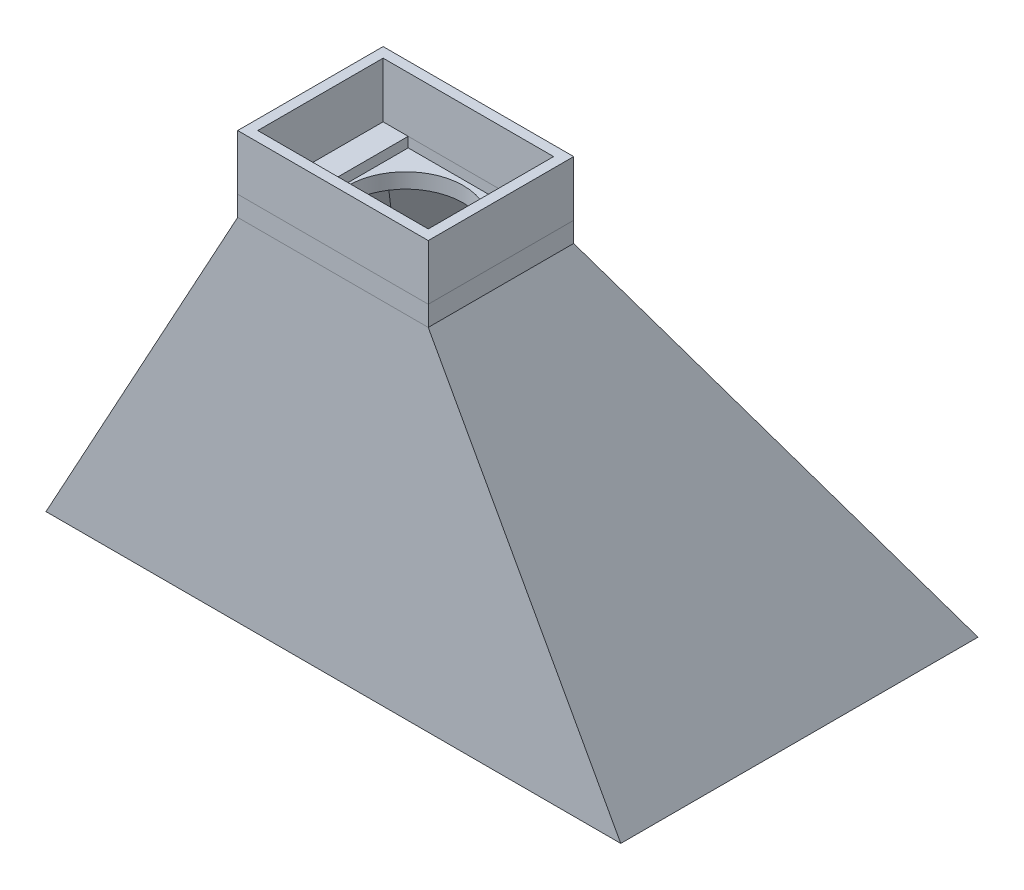
ISO-10303-21;
HEADER;
FILE_DESCRIPTION(('STEP AP214'),'2;1');
FILE_NAME('part.step','',(''),(''),'','','');
FILE_SCHEMA(('AUTOMOTIVE_DESIGN { 1 0 10303 214 1 1 1 1 }'));
ENDSEC;
DATA;
#1=APPLICATION_CONTEXT('core data for automotive mechanical design processes');
#2=APPLICATION_PROTOCOL_DEFINITION('international standard','automotive_design',2000,#1);
#3=PRODUCT_CONTEXT('',#1,'mechanical');
#4=PRODUCT('Part','Part','',(#3));
#5=PRODUCT_RELATED_PRODUCT_CATEGORY('part','',(#4));
#6=PRODUCT_DEFINITION_FORMATION('','',#4);
#7=PRODUCT_DEFINITION_CONTEXT('part definition',#1,'design');
#8=PRODUCT_DEFINITION('design','',#6,#7);
#9=PRODUCT_DEFINITION_SHAPE('','',#8);
#10=(LENGTH_UNIT() NAMED_UNIT(*) SI_UNIT(.MILLI.,.METRE.));
#11=(NAMED_UNIT(*) PLANE_ANGLE_UNIT() SI_UNIT($,.RADIAN.));
#12=(NAMED_UNIT(*) SI_UNIT($,.STERADIAN.) SOLID_ANGLE_UNIT());
#13=UNCERTAINTY_MEASURE_WITH_UNIT(LENGTH_MEASURE(1.E-05),#10,'distance_accuracy_value','');
#14=(GEOMETRIC_REPRESENTATION_CONTEXT(3) GLOBAL_UNCERTAINTY_ASSIGNED_CONTEXT((#13)) GLOBAL_UNIT_ASSIGNED_CONTEXT((#10,
#11,#12)) REPRESENTATION_CONTEXT('',''));
#15=CARTESIAN_POINT('',(0.,0.,0.));
#16=DIRECTION('',(0.,0.,1.));
#17=DIRECTION('',(1.,0.,0.));
#18=AXIS2_PLACEMENT_3D('',#15,#16,#17);
#19=CARTESIAN_POINT('',(0.,1789.,0.));
#20=DIRECTION('',(0.,-1.,0.));
#21=DIRECTION('',(0.,0.,-1.));
#22=AXIS2_PLACEMENT_3D('',#19,#20,#21);
#23=PLANE('',#22);
#24=DIRECTION('',(0.,0.,-1.));
#25=VECTOR('',#24,1.);
#26=CARTESIAN_POINT('',(926.,1789.,2.));
#27=LINE('',#26,#25);
#28=CARTESIAN_POINT('',(926.,1789.,2.));
#29=VERTEX_POINT('',#28);
#30=CARTESIAN_POINT('',(926.,1789.,-27.));
#31=VERTEX_POINT('',#30);
#32=EDGE_CURVE('E294',#29,#31,#27,.T.);
#33=ORIENTED_EDGE('',*,*,#32,.F.);
#34=DIRECTION('',(-1.,0.,0.));
#35=VECTOR('',#34,1.);
#36=CARTESIAN_POINT('',(926.,1789.,2.));
#37=LINE('',#36,#35);
#38=CARTESIAN_POINT('',(964.,1789.,2.));
#39=VERTEX_POINT('',#38);
#40=EDGE_CURVE('E300',#39,#29,#37,.T.);
#41=ORIENTED_EDGE('',*,*,#40,.F.);
#42=DIRECTION('',(0.,0.,1.));
#43=VECTOR('',#42,1.);
#44=CARTESIAN_POINT('',(964.,1789.,2.));
#45=LINE('',#44,#43);
#46=CARTESIAN_POINT('',(964.,1789.,-27.));
#47=VERTEX_POINT('',#46);
#48=EDGE_CURVE('E298',#47,#39,#45,.T.);
#49=ORIENTED_EDGE('',*,*,#48,.F.);
#50=DIRECTION('',(1.,0.,0.));
#51=VECTOR('',#50,1.);
#52=CARTESIAN_POINT('',(926.,1789.,-27.));
#53=LINE('',#52,#51);
#54=EDGE_CURVE('E112',#31,#47,#53,.T.);
#55=ORIENTED_EDGE('',*,*,#54,.F.);
#56=EDGE_LOOP('',(#33,#41,#49,#55));
#57=FACE_BOUND('',#56,.T.);
#58=DIRECTION('',(-1.,0.,0.));
#59=VECTOR('',#58,1.);
#60=CARTESIAN_POINT('',(933.,1789.,0.));
#61=LINE('',#60,#59);
#62=CARTESIAN_POINT('',(957.,1789.,0.));
#63=VERTEX_POINT('',#62);
#64=CARTESIAN_POINT('',(933.,1789.,0.));
#65=VERTEX_POINT('',#64);
#66=EDGE_CURVE('E272',#63,#65,#61,.T.);
#67=ORIENTED_EDGE('',*,*,#66,.T.);
#68=DIRECTION('',(0.,0.,-1.));
#69=VECTOR('',#68,1.);
#70=CARTESIAN_POINT('',(933.,1789.,0.));
#71=LINE('',#70,#69);
#72=CARTESIAN_POINT('',(933.,1789.,-25.));
#73=VERTEX_POINT('',#72);
#74=EDGE_CURVE('E275',#65,#73,#71,.T.);
#75=ORIENTED_EDGE('',*,*,#74,.T.);
#76=DIRECTION('',(1.,0.,0.));
#77=VECTOR('',#76,1.);
#78=CARTESIAN_POINT('',(933.,1789.,-25.));
#79=LINE('',#78,#77);
#80=CARTESIAN_POINT('',(957.,1789.,-25.));
#81=VERTEX_POINT('',#80);
#82=EDGE_CURVE('E278',#73,#81,#79,.T.);
#83=ORIENTED_EDGE('',*,*,#82,.T.);
#84=DIRECTION('',(0.,0.,1.));
#85=VECTOR('',#84,1.);
#86=CARTESIAN_POINT('',(957.,1789.,-25.));
#87=LINE('',#86,#85);
#88=EDGE_CURVE('E264',#81,#63,#87,.T.);
#89=ORIENTED_EDGE('',*,*,#88,.T.);
#90=EDGE_LOOP('',(#67,#75,#83,#89));
#91=FACE_BOUND('',#90,.T.);
#92=ADVANCED_FACE('F54',(#57,#91),#23,.F.);
#93=CARTESIAN_POINT('',(926.,1787.,2.));
#94=DIRECTION('',(1.,0.,0.));
#95=DIRECTION('',(0.,0.,-1.));
#96=AXIS2_PLACEMENT_3D('',#93,#94,#95);
#97=PLANE('',#96);
#98=ORIENTED_EDGE('',*,*,#32,.T.);
#99=DIRECTION('',(0.,1.,0.));
#100=VECTOR('',#99,1.);
#101=CARTESIAN_POINT('',(926.,1787.,-27.));
#102=LINE('',#101,#100);
#103=CARTESIAN_POINT('',(926.,1785.,-27.0000000000001));
#104=VERTEX_POINT('',#103);
#105=EDGE_CURVE('E13',#104,#31,#102,.T.);
#106=ORIENTED_EDGE('',*,*,#105,.F.);
#107=DIRECTION('',(0.,0.,1.));
#108=VECTOR('',#107,1.);
#109=CARTESIAN_POINT('',(926.,1785.,0.));
#110=LINE('',#109,#108);
#111=CARTESIAN_POINT('',(926.,1785.,2.));
#112=VERTEX_POINT('',#111);
#113=EDGE_CURVE('E138',#112,#104,#110,.F.);
#114=ORIENTED_EDGE('',*,*,#113,.F.);
#115=DIRECTION('',(0.,1.,0.));
#116=VECTOR('',#115,1.);
#117=CARTESIAN_POINT('',(926.,1787.,2.));
#118=LINE('',#117,#116);
#119=EDGE_CURVE('E303',#112,#29,#118,.T.);
#120=ORIENTED_EDGE('',*,*,#119,.T.);
#121=EDGE_LOOP('',(#98,#106,#114,#120));
#122=FACE_BOUND('',#121,.T.);
#123=ADVANCED_FACE('F56',(#122),#97,.F.);
#124=CARTESIAN_POINT('',(926.,1787.,-27.));
#125=DIRECTION('',(0.,0.,1.));
#126=DIRECTION('',(1.,0.,0.));
#127=AXIS2_PLACEMENT_3D('',#124,#125,#126);
#128=PLANE('',#127);
#129=ORIENTED_EDGE('',*,*,#54,.T.);
#130=DIRECTION('',(0.,1.,0.));
#131=VECTOR('',#130,1.);
#132=CARTESIAN_POINT('',(964.,1787.,-27.));
#133=LINE('',#132,#131);
#134=CARTESIAN_POINT('',(964.,1785.,-27.));
#135=VERTEX_POINT('',#134);
#136=EDGE_CURVE('E63',#135,#47,#133,.T.);
#137=ORIENTED_EDGE('',*,*,#136,.F.);
#138=DIRECTION('',(1.,0.,0.));
#139=VECTOR('',#138,1.);
#140=CARTESIAN_POINT('',(-7.84704029134025E-13,1785.,-26.9999999999996));
#141=LINE('',#140,#139);
#142=EDGE_CURVE('E108',#104,#135,#141,.T.);
#143=ORIENTED_EDGE('',*,*,#142,.F.);
#144=ORIENTED_EDGE('',*,*,#105,.T.);
#145=EDGE_LOOP('',(#129,#137,#143,#144));
#146=FACE_BOUND('',#145,.T.);
#147=ADVANCED_FACE('F106',(#146),#128,.F.);
#148=CARTESIAN_POINT('',(964.,1787.,2.));
#149=DIRECTION('',(-1.,0.,0.));
#150=DIRECTION('',(0.,0.,1.));
#151=AXIS2_PLACEMENT_3D('',#148,#149,#150);
#152=PLANE('',#151);
#153=ORIENTED_EDGE('',*,*,#48,.T.);
#154=DIRECTION('',(0.,1.,0.));
#155=VECTOR('',#154,1.);
#156=CARTESIAN_POINT('',(964.,1787.,2.));
#157=LINE('',#156,#155);
#158=CARTESIAN_POINT('',(964.,1785.,1.99999999999999));
#159=VERTEX_POINT('',#158);
#160=EDGE_CURVE('E116',#159,#39,#157,.T.);
#161=ORIENTED_EDGE('',*,*,#160,.F.);
#162=DIRECTION('',(0.,0.,1.));
#163=VECTOR('',#162,1.);
#164=CARTESIAN_POINT('',(964.,1785.,-4.65563815571769E-12));
#165=LINE('',#164,#163);
#166=EDGE_CURVE('E119',#135,#159,#165,.T.);
#167=ORIENTED_EDGE('',*,*,#166,.F.);
#168=ORIENTED_EDGE('',*,*,#136,.T.);
#169=EDGE_LOOP('',(#153,#161,#167,#168));
#170=FACE_BOUND('',#169,.T.);
#171=ADVANCED_FACE('F120',(#170),#152,.F.);
#172=CARTESIAN_POINT('',(926.,1787.,2.));
#173=DIRECTION('',(0.,0.,-1.));
#174=DIRECTION('',(-1.,0.,0.));
#175=AXIS2_PLACEMENT_3D('',#172,#173,#174);
#176=PLANE('',#175);
#177=ORIENTED_EDGE('',*,*,#40,.T.);
#178=ORIENTED_EDGE('',*,*,#119,.F.);
#179=DIRECTION('',(1.,0.,0.));
#180=VECTOR('',#179,1.);
#181=CARTESIAN_POINT('',(0.,1785.,2.00000000000018));
#182=LINE('',#181,#180);
#183=EDGE_CURVE('E127',#159,#112,#182,.F.);
#184=ORIENTED_EDGE('',*,*,#183,.F.);
#185=ORIENTED_EDGE('',*,*,#160,.T.);
#186=EDGE_LOOP('',(#177,#178,#184,#185));
#187=FACE_BOUND('',#186,.T.);
#188=ADVANCED_FACE('F311',(#187),#176,.F.);
#189=CARTESIAN_POINT('',(933.,1787.,0.));
#190=DIRECTION('',(0.,0.,-1.));
#191=DIRECTION('',(-1.,0.,0.));
#192=AXIS2_PLACEMENT_3D('',#189,#190,#191);
#193=PLANE('',#192);
#194=ORIENTED_EDGE('',*,*,#66,.F.);
#195=DIRECTION('',(0.,1.,0.));
#196=VECTOR('',#195,1.);
#197=CARTESIAN_POINT('',(957.,1787.,0.));
#198=LINE('',#197,#196);
#199=CARTESIAN_POINT('',(957.,1787.,0.));
#200=VERTEX_POINT('',#199);
#201=EDGE_CURVE('E271',#200,#63,#198,.T.);
#202=ORIENTED_EDGE('',*,*,#201,.F.);
#203=DIRECTION('',(-1.,0.,0.));
#204=VECTOR('',#203,1.);
#205=CARTESIAN_POINT('',(933.,1787.,0.));
#206=LINE('',#205,#204);
#207=CARTESIAN_POINT('',(933.,1787.,0.));
#208=VERTEX_POINT('',#207);
#209=EDGE_CURVE('E260',#200,#208,#206,.T.);
#210=ORIENTED_EDGE('',*,*,#209,.T.);
#211=DIRECTION('',(0.,1.,0.));
#212=VECTOR('',#211,1.);
#213=CARTESIAN_POINT('',(933.,1787.,0.));
#214=LINE('',#213,#212);
#215=EDGE_CURVE('E291',#208,#65,#214,.T.);
#216=ORIENTED_EDGE('',*,*,#215,.T.);
#217=EDGE_LOOP('',(#194,#202,#210,#216));
#218=FACE_BOUND('',#217,.T.);
#219=ADVANCED_FACE('F336',(#218),#193,.T.);
#220=CARTESIAN_POINT('',(933.,1787.,0.));
#221=DIRECTION('',(1.,0.,0.));
#222=DIRECTION('',(0.,0.,-1.));
#223=AXIS2_PLACEMENT_3D('',#220,#221,#222);
#224=PLANE('',#223);
#225=ORIENTED_EDGE('',*,*,#74,.F.);
#226=ORIENTED_EDGE('',*,*,#215,.F.);
#227=DIRECTION('',(0.,0.,-1.));
#228=VECTOR('',#227,1.);
#229=CARTESIAN_POINT('',(933.,1787.,0.));
#230=LINE('',#229,#228);
#231=CARTESIAN_POINT('',(933.,1787.,-25.));
#232=VERTEX_POINT('',#231);
#233=EDGE_CURVE('E263',#208,#232,#230,.T.);
#234=ORIENTED_EDGE('',*,*,#233,.T.);
#235=DIRECTION('',(0.,1.,0.));
#236=VECTOR('',#235,1.);
#237=CARTESIAN_POINT('',(933.,1787.,-25.));
#238=LINE('',#237,#236);
#239=EDGE_CURVE('E288',#232,#73,#238,.T.);
#240=ORIENTED_EDGE('',*,*,#239,.T.);
#241=EDGE_LOOP('',(#225,#226,#234,#240));
#242=FACE_BOUND('',#241,.T.);
#243=ADVANCED_FACE('F349',(#242),#224,.T.);
#244=CARTESIAN_POINT('',(933.,1787.,-25.));
#245=DIRECTION('',(0.,0.,1.));
#246=DIRECTION('',(1.,0.,0.));
#247=AXIS2_PLACEMENT_3D('',#244,#245,#246);
#248=PLANE('',#247);
#249=ORIENTED_EDGE('',*,*,#82,.F.);
#250=ORIENTED_EDGE('',*,*,#239,.F.);
#251=DIRECTION('',(1.,0.,0.));
#252=VECTOR('',#251,1.);
#253=CARTESIAN_POINT('',(933.,1787.,-25.));
#254=LINE('',#253,#252);
#255=CARTESIAN_POINT('',(957.,1787.,-25.));
#256=VERTEX_POINT('',#255);
#257=EDGE_CURVE('E267',#232,#256,#254,.T.);
#258=ORIENTED_EDGE('',*,*,#257,.T.);
#259=DIRECTION('',(0.,1.,0.));
#260=VECTOR('',#259,1.);
#261=CARTESIAN_POINT('',(957.,1787.,-25.));
#262=LINE('',#261,#260);
#263=EDGE_CURVE('E285',#256,#81,#262,.T.);
#264=ORIENTED_EDGE('',*,*,#263,.T.);
#265=EDGE_LOOP('',(#249,#250,#258,#264));
#266=FACE_BOUND('',#265,.T.);
#267=ADVANCED_FACE('F351',(#266),#248,.T.);
#268=CARTESIAN_POINT('',(957.,1787.,-25.));
#269=DIRECTION('',(-1.,0.,0.));
#270=DIRECTION('',(0.,0.,1.));
#271=AXIS2_PLACEMENT_3D('',#268,#269,#270);
#272=PLANE('',#271);
#273=ORIENTED_EDGE('',*,*,#88,.F.);
#274=ORIENTED_EDGE('',*,*,#263,.F.);
#275=DIRECTION('',(0.,0.,1.));
#276=VECTOR('',#275,1.);
#277=CARTESIAN_POINT('',(957.,1787.,-25.));
#278=LINE('',#277,#276);
#279=EDGE_CURVE('E80',#256,#200,#278,.T.);
#280=ORIENTED_EDGE('',*,*,#279,.T.);
#281=ORIENTED_EDGE('',*,*,#201,.T.);
#282=EDGE_LOOP('',(#273,#274,#280,#281));
#283=FACE_BOUND('',#282,.T.);
#284=ADVANCED_FACE('F340',(#283),#272,.T.);
#285=CARTESIAN_POINT('',(0.,1787.,0.));
#286=DIRECTION('',(0.,-1.,0.));
#287=DIRECTION('',(0.,0.,-1.));
#288=AXIS2_PLACEMENT_3D('',#285,#286,#287);
#289=PLANE('',#288);
#290=ORIENTED_EDGE('',*,*,#233,.F.);
#291=ORIENTED_EDGE('',*,*,#209,.F.);
#292=ORIENTED_EDGE('',*,*,#279,.F.);
#293=ORIENTED_EDGE('',*,*,#257,.F.);
#294=EDGE_LOOP('',(#290,#291,#292,#293));
#295=FACE_BOUND('',#294,.T.);
#296=CARTESIAN_POINT('',(945.,1787.,-12.5));
#297=DIRECTION('',(0.,-1.,0.));
#298=DIRECTION('',(0.,0.,-1.));
#299=AXIS2_PLACEMENT_3D('',#296,#297,#298);
#300=CIRCLE('',#299,11.4999999999999);
#301=CARTESIAN_POINT('',(945.,1787.,-23.9999999999999));
#302=VERTEX_POINT('',#301);
#303=EDGE_CURVE('E207',#302,#302,#300,.T.);
#304=ORIENTED_EDGE('',*,*,#303,.T.);
#305=EDGE_LOOP('',(#304));
#306=FACE_BOUND('',#305,.T.);
#307=ADVANCED_FACE('F352',(#295,#306),#289,.F.);
#308=CARTESIAN_POINT('',(945.,1785.,-12.5));
#309=DIRECTION('',(0.,1.,0.));
#310=DIRECTION('',(0.,0.,1.));
#311=AXIS2_PLACEMENT_3D('',#308,#309,#310);
#312=CYLINDRICAL_SURFACE('',#311,11.4999999999999);
#313=ORIENTED_EDGE('',*,*,#303,.F.);
#314=EDGE_LOOP('',(#313));
#315=FACE_BOUND('',#314,.T.);
#316=CARTESIAN_POINT('',(945.,1784.,-12.5));
#317=DIRECTION('',(0.,-1.,0.));
#318=DIRECTION('',(0.,0.,-1.));
#319=AXIS2_PLACEMENT_3D('',#316,#317,#318);
#320=CIRCLE('',#319,11.4999999999999);
#321=CARTESIAN_POINT('',(945.,1784.,-23.9999999999999));
#322=VERTEX_POINT('',#321);
#323=EDGE_CURVE('E58',#322,#322,#320,.T.);
#324=ORIENTED_EDGE('',*,*,#323,.T.);
#325=EDGE_LOOP('',(#324));
#326=FACE_BOUND('',#325,.T.);
#327=ADVANCED_FACE('F228',(#315,#326),#312,.F.);
#328=CARTESIAN_POINT('',(0.,1715.,0.));
#329=DIRECTION('',(0.,1.,0.));
#330=DIRECTION('',(0.,0.,1.));
#331=AXIS2_PLACEMENT_3D('',#328,#329,#330);
#332=PLANE('',#331);
#333=DIRECTION('',(0.,0.,1.));
#334=VECTOR('',#333,1.);
#335=CARTESIAN_POINT('',(888.83695482547,1715.,0.));
#336=LINE('',#335,#334);
#337=CARTESIAN_POINT('',(888.83695482547,1715.,-68.1467460197159));
#338=VERTEX_POINT('',#337);
#339=CARTESIAN_POINT('',(888.83695482547,1715.,0.917271520761381));
#340=VERTEX_POINT('',#339);
#341=EDGE_CURVE('E415',#338,#340,#336,.T.);
#342=ORIENTED_EDGE('',*,*,#341,.T.);
#343=DIRECTION('',(1.,0.,0.));
#344=VECTOR('',#343,1.);
#345=CARTESIAN_POINT('',(0.,1715.,0.917271520761555));
#346=LINE('',#345,#344);
#347=CARTESIAN_POINT('',(1001.16304517453,1715.,0.91727152076136));
#348=VERTEX_POINT('',#347);
#349=EDGE_CURVE('E380',#340,#348,#346,.T.);
#350=ORIENTED_EDGE('',*,*,#349,.T.);
#351=DIRECTION('',(0.,0.,-1.));
#352=VECTOR('',#351,1.);
#353=CARTESIAN_POINT('',(1001.16304517453,1715.,-3.12080514548774E-12));
#354=LINE('',#353,#352);
#355=CARTESIAN_POINT('',(1001.16304517453,1715.,-68.146746019716));
#356=VERTEX_POINT('',#355);
#357=EDGE_CURVE('E432',#348,#356,#354,.T.);
#358=ORIENTED_EDGE('',*,*,#357,.T.);
#359=DIRECTION('',(-1.,0.,0.));
#360=VECTOR('',#359,1.);
#361=CARTESIAN_POINT('',(0.,1715.,-68.146746019715));
#362=LINE('',#361,#360);
#363=EDGE_CURVE('E430',#356,#338,#362,.T.);
#364=ORIENTED_EDGE('',*,*,#363,.T.);
#365=EDGE_LOOP('',(#342,#350,#358,#364));
#366=FACE_BOUND('',#365,.T.);
#367=DIRECTION('',(1.,0.,0.));
#368=VECTOR('',#367,1.);
#369=CARTESIAN_POINT('',(887.69703745109,1715.,1.91727221911682));
#370=LINE('',#369,#368);
#371=CARTESIAN_POINT('',(887.69703745109,1715.,1.91727221911682));
#372=VERTEX_POINT('',#371);
#373=CARTESIAN_POINT('',(1002.30296254891,1715.,1.9172722191168));
#374=VERTEX_POINT('',#373);
#375=EDGE_CURVE('E147',#372,#374,#370,.T.);
#376=ORIENTED_EDGE('',*,*,#375,.F.);
#377=DIRECTION('',(0.,0.,1.));
#378=VECTOR('',#377,1.);
#379=CARTESIAN_POINT('',(887.69703745109,1715.,-69.315259921744));
#380=LINE('',#379,#378);
#381=CARTESIAN_POINT('',(887.69703745109,1715.,-69.315259921744));
#382=VERTEX_POINT('',#381);
#383=EDGE_CURVE('E162',#382,#372,#380,.T.);
#384=ORIENTED_EDGE('',*,*,#383,.F.);
#385=DIRECTION('',(-1.,0.,0.));
#386=VECTOR('',#385,1.);
#387=CARTESIAN_POINT('',(1002.30296254891,1715.,-69.3152599217441));
#388=LINE('',#387,#386);
#389=CARTESIAN_POINT('',(1002.30296254891,1715.,-69.3152599217441));
#390=VERTEX_POINT('',#389);
#391=EDGE_CURVE('E208',#390,#382,#388,.T.);
#392=ORIENTED_EDGE('',*,*,#391,.F.);
#393=DIRECTION('',(0.,0.,-1.));
#394=VECTOR('',#393,1.);
#395=CARTESIAN_POINT('',(1002.30296254891,1715.,1.9172722191168));
#396=LINE('',#395,#394);
#397=EDGE_CURVE('E142',#374,#390,#396,.T.);
#398=ORIENTED_EDGE('',*,*,#397,.F.);
#399=EDGE_LOOP('',(#376,#384,#392,#398));
#400=FACE_BOUND('',#399,.T.);
#401=ADVANCED_FACE('F180',(#366,#400),#332,.F.);
#402=CARTESIAN_POINT('',(-39.0373182757036,21.3606419989165,0.));
#403=DIRECTION('',(-0.877256564796277,0.480021790673961,0.));
#404=DIRECTION('',(-0.480021790673961,-0.877256564796277,0.));
#405=AXIS2_PLACEMENT_3D('',#402,#403,#404);
#406=PLANE('',#405);
#407=DIRECTION('',(-0.42408074067374,-0.775022344792662,-0.468503885215157));
#408=VECTOR('',#407,1.);
#409=CARTESIAN_POINT('',(926.,1785.,-27.));
#410=LINE('',#409,#408);
#411=EDGE_CURVE('E137',#104,#382,#410,.T.);
#412=ORIENTED_EDGE('',*,*,#411,.T.);
#413=ORIENTED_EDGE('',*,*,#383,.T.);
#414=DIRECTION('',(-0.480021532691293,-0.877256093323952,-0.00103676356952763));
#415=VECTOR('',#414,1.);
#416=CARTESIAN_POINT('',(926.,1785.,2.));
#417=LINE('',#416,#415);
#418=EDGE_CURVE('E145',#112,#372,#417,.T.);
#419=ORIENTED_EDGE('',*,*,#418,.F.);
#420=ORIENTED_EDGE('',*,*,#113,.T.);
#421=EDGE_LOOP('',(#412,#413,#419,#420));
#422=FACE_BOUND('',#421,.T.);
#423=ADVANCED_FACE('F169',(#422),#406,.T.);
#424=CARTESIAN_POINT('',(0.,0.000129478738369063,-0.109558259499705));
#425=DIRECTION('',(0.,-0.00118182461585467,0.999999301645045));
#426=DIRECTION('',(0.,-0.999999301645045,-0.00118182461585467));
#427=AXIS2_PLACEMENT_3D('',#424,#425,#426);
#428=PLANE('',#427);
#429=ORIENTED_EDGE('',*,*,#418,.T.);
#430=ORIENTED_EDGE('',*,*,#375,.T.);
#431=DIRECTION('',(0.480021532691293,-0.877256093323952,-0.00103676356952791));
#432=VECTOR('',#431,1.);
#433=CARTESIAN_POINT('',(964.,1785.,2.));
#434=LINE('',#433,#432);
#435=EDGE_CURVE('E144',#159,#374,#434,.T.);
#436=ORIENTED_EDGE('',*,*,#435,.F.);
#437=ORIENTED_EDGE('',*,*,#183,.T.);
#438=EDGE_LOOP('',(#429,#430,#436,#437));
#439=FACE_BOUND('',#438,.T.);
#440=ADVANCED_FACE('F179',(#439),#428,.T.);
#441=CARTESIAN_POINT('',(-7.84704029134025E-13,489.667969662552,-810.033022124136));
#442=DIRECTION('',(0.,0.517326933054394,-0.855787850075318));
#443=DIRECTION('',(0.,0.855787850075318,0.517326933054394));
#444=AXIS2_PLACEMENT_3D('',#441,#442,#443);
#445=PLANE('',#444);
#446=DIRECTION('',(0.424080740673737,-0.775022344792662,-0.468503885215158));
#447=VECTOR('',#446,1.);
#448=CARTESIAN_POINT('',(964.,1785.,-27.));
#449=LINE('',#448,#447);
#450=EDGE_CURVE('E135',#135,#390,#449,.T.);
#451=ORIENTED_EDGE('',*,*,#450,.T.);
#452=ORIENTED_EDGE('',*,*,#391,.T.);
#453=ORIENTED_EDGE('',*,*,#411,.F.);
#454=ORIENTED_EDGE('',*,*,#142,.T.);
#455=EDGE_LOOP('',(#451,#452,#453,#454));
#456=FACE_BOUND('',#455,.T.);
#457=ADVANCED_FACE('F132',(#456),#445,.T.);
#458=CARTESIAN_POINT('',(1493.54178037943,817.24392684437,-4.65563815571769E-12));
#459=DIRECTION('',(0.877256564796277,0.480021790673961,0.));
#460=DIRECTION('',(-0.480021790673961,0.877256564796277,0.));
#461=AXIS2_PLACEMENT_3D('',#458,#459,#460);
#462=PLANE('',#461);
#463=ORIENTED_EDGE('',*,*,#435,.T.);
#464=ORIENTED_EDGE('',*,*,#397,.T.);
#465=ORIENTED_EDGE('',*,*,#450,.F.);
#466=ORIENTED_EDGE('',*,*,#166,.T.);
#467=EDGE_LOOP('',(#463,#464,#465,#466));
#468=FACE_BOUND('',#467,.T.);
#469=ADVANCED_FACE('F140',(#468),#462,.T.);
#470=CARTESIAN_POINT('',(0.,1788.,0.));
#471=DIRECTION('',(0.,-1.,0.));
#472=DIRECTION('',(0.,0.,-1.));
#473=AXIS2_PLACEMENT_3D('',#470,#471,#472);
#474=PLANE('',#473);
#475=DIRECTION('',(0.,0.,1.));
#476=VECTOR('',#475,1.);
#477=CARTESIAN_POINT('',(958.,1788.,-25.));
#478=LINE('',#477,#476);
#479=CARTESIAN_POINT('',(958.,1788.,-26.));
#480=VERTEX_POINT('',#479);
#481=CARTESIAN_POINT('',(958.,1788.,0.99999999999999));
#482=VERTEX_POINT('',#481);
#483=EDGE_CURVE('E391',#480,#482,#478,.T.);
#484=ORIENTED_EDGE('',*,*,#483,.F.);
#485=DIRECTION('',(1.,0.,0.));
#486=VECTOR('',#485,1.);
#487=CARTESIAN_POINT('',(926.,1788.,-26.));
#488=LINE('',#487,#486);
#489=CARTESIAN_POINT('',(963.,1788.,-26.));
#490=VERTEX_POINT('',#489);
#491=EDGE_CURVE('E506',#480,#490,#488,.T.);
#492=ORIENTED_EDGE('',*,*,#491,.T.);
#493=DIRECTION('',(0.,0.,1.));
#494=VECTOR('',#493,1.);
#495=CARTESIAN_POINT('',(963.,1788.,2.));
#496=LINE('',#495,#494);
#497=CARTESIAN_POINT('',(963.,1788.,1.));
#498=VERTEX_POINT('',#497);
#499=EDGE_CURVE('E501',#490,#498,#496,.T.);
#500=ORIENTED_EDGE('',*,*,#499,.T.);
#501=DIRECTION('',(-1.,0.,0.));
#502=VECTOR('',#501,1.);
#503=CARTESIAN_POINT('',(926.,1788.,1.));
#504=LINE('',#503,#502);
#505=EDGE_CURVE('E496',#498,#482,#504,.T.);
#506=ORIENTED_EDGE('',*,*,#505,.T.);
#507=EDGE_LOOP('',(#484,#492,#500,#506));
#508=FACE_BOUND('',#507,.T.);
#509=ADVANCED_FACE('F609',(#508),#474,.T.);
#510=DIRECTION('',(0.,0.,-1.));
#511=VECTOR('',#510,1.);
#512=CARTESIAN_POINT('',(927.,1788.,2.));
#513=LINE('',#512,#511);
#514=CARTESIAN_POINT('',(927.,1788.,1.));
#515=VERTEX_POINT('',#514);
#516=CARTESIAN_POINT('',(927.,1788.,-26.));
#517=VERTEX_POINT('',#516);
#518=EDGE_CURVE('E395',#515,#517,#513,.T.);
#519=ORIENTED_EDGE('',*,*,#518,.T.);
#520=CARTESIAN_POINT('',(932.,1788.,-26.));
#521=VERTEX_POINT('',#520);
#522=EDGE_CURVE('E489',#517,#521,#488,.T.);
#523=ORIENTED_EDGE('',*,*,#522,.T.);
#524=DIRECTION('',(0.,0.,-1.));
#525=VECTOR('',#524,1.);
#526=CARTESIAN_POINT('',(932.,1788.,0.));
#527=LINE('',#526,#525);
#528=CARTESIAN_POINT('',(932.,1788.,0.999999999999999));
#529=VERTEX_POINT('',#528);
#530=EDGE_CURVE('E475',#529,#521,#527,.T.);
#531=ORIENTED_EDGE('',*,*,#530,.F.);
#532=EDGE_CURVE('E486',#529,#515,#504,.T.);
#533=ORIENTED_EDGE('',*,*,#532,.T.);
#534=EDGE_LOOP('',(#519,#523,#531,#533));
#535=FACE_BOUND('',#534,.T.);
#536=ADVANCED_FACE('F484',(#535),#474,.T.);
#537=CARTESIAN_POINT('',(927.,1787.,2.));
#538=DIRECTION('',(1.,0.,0.));
#539=DIRECTION('',(0.,0.,-1.));
#540=AXIS2_PLACEMENT_3D('',#537,#538,#539);
#541=PLANE('',#540);
#542=ORIENTED_EDGE('',*,*,#518,.F.);
#543=DIRECTION('',(0.,1.,0.));
#544=VECTOR('',#543,1.);
#545=CARTESIAN_POINT('',(927.,1787.,1.));
#546=LINE('',#545,#544);
#547=CARTESIAN_POINT('',(927.,1785.00059091251,1.));
#548=VERTEX_POINT('',#547);
#549=EDGE_CURVE('E494',#548,#515,#546,.T.);
#550=ORIENTED_EDGE('',*,*,#549,.F.);
#551=DIRECTION('',(0.,0.999999301645045,0.00118182461585467));
#552=VECTOR('',#551,1.);
#553=CARTESIAN_POINT('',(927.,0.00131130335422394,-1.10955756114493));
#554=LINE('',#553,#552);
#555=CARTESIAN_POINT('',(927.,1784.74429611824,0.999697104291685));
#556=VERTEX_POINT('',#555);
#557=EDGE_CURVE('E419',#556,#548,#554,.T.);
#558=ORIENTED_EDGE('',*,*,#557,.F.);
#559=DIRECTION('',(0.,0.,-1.));
#560=VECTOR('',#559,1.);
#561=CARTESIAN_POINT('',(927.,1784.74429611824,0.));
#562=LINE('',#561,#560);
#563=CARTESIAN_POINT('',(927.,1784.74429611824,-26.));
#564=VERTEX_POINT('',#563);
#565=EDGE_CURVE('E411',#556,#564,#562,.T.);
#566=ORIENTED_EDGE('',*,*,#565,.T.);
#567=DIRECTION('',(0.,1.,0.));
#568=VECTOR('',#567,1.);
#569=CARTESIAN_POINT('',(927.,1787.,-26.));
#570=LINE('',#569,#568);
#571=EDGE_CURVE('E420',#564,#517,#570,.T.);
#572=ORIENTED_EDGE('',*,*,#571,.T.);
#573=EDGE_LOOP('',(#542,#550,#558,#566,#572));
#574=FACE_BOUND('',#573,.T.);
#575=ADVANCED_FACE('F537',(#574),#541,.T.);
#576=CARTESIAN_POINT('',(926.,1787.,-26.));
#577=DIRECTION('',(0.,0.,1.));
#578=DIRECTION('',(1.,0.,0.));
#579=AXIS2_PLACEMENT_3D('',#576,#577,#578);
#580=PLANE('',#579);
#581=DIRECTION('',(1.,0.,0.));
#582=VECTOR('',#581,1.);
#583=CARTESIAN_POINT('',(933.,1786.,-26.));
#584=LINE('',#583,#582);
#585=CARTESIAN_POINT('',(932.,1786.,-26.));
#586=VERTEX_POINT('',#585);
#587=CARTESIAN_POINT('',(958.,1786.,-26.));
#588=VERTEX_POINT('',#587);
#589=EDGE_CURVE('E399',#586,#588,#584,.T.);
#590=ORIENTED_EDGE('',*,*,#589,.F.);
#591=DIRECTION('',(0.,1.,0.));
#592=VECTOR('',#591,1.);
#593=CARTESIAN_POINT('',(932.,1787.,-26.));
#594=LINE('',#593,#592);
#595=EDGE_CURVE('E396',#586,#521,#594,.T.);
#596=ORIENTED_EDGE('',*,*,#595,.T.);
#597=ORIENTED_EDGE('',*,*,#522,.F.);
#598=ORIENTED_EDGE('',*,*,#571,.F.);
#599=DIRECTION('',(0.480021790673961,0.877256564796277,0.));
#600=VECTOR('',#599,1.);
#601=CARTESIAN_POINT('',(-38.1600617109074,20.8806202082426,-26.));
#602=LINE('',#601,#600);
#603=CARTESIAN_POINT('',(926.987381818878,1784.72123595214,-26.));
#604=VERTEX_POINT('',#603);
#605=EDGE_CURVE('E416',#604,#564,#602,.T.);
#606=ORIENTED_EDGE('',*,*,#605,.F.);
#607=DIRECTION('',(1.,0.,0.));
#608=VECTOR('',#607,1.);
#609=CARTESIAN_POINT('',(-2.86005626567288E-12,1784.72123595214,-26.));
#610=LINE('',#609,#608);
#611=CARTESIAN_POINT('',(963.012618181122,1784.72123595214,-26.));
#612=VERTEX_POINT('',#611);
#613=EDGE_CURVE('E515',#604,#612,#610,.T.);
#614=ORIENTED_EDGE('',*,*,#613,.T.);
#615=DIRECTION('',(0.480021790673961,-0.877256564796277,0.));
#616=VECTOR('',#615,1.);
#617=CARTESIAN_POINT('',(1492.66452381464,816.763905053696,-26.));
#618=LINE('',#617,#616);
#619=CARTESIAN_POINT('',(963.,1784.74429611824,-26.));
#620=VERTEX_POINT('',#619);
#621=EDGE_CURVE('E426',#620,#612,#618,.T.);
#622=ORIENTED_EDGE('',*,*,#621,.F.);
#623=DIRECTION('',(0.,1.,0.));
#624=VECTOR('',#623,1.);
#625=CARTESIAN_POINT('',(963.,1787.,-26.));
#626=LINE('',#625,#624);
#627=EDGE_CURVE('E513',#620,#490,#626,.T.);
#628=ORIENTED_EDGE('',*,*,#627,.T.);
#629=ORIENTED_EDGE('',*,*,#491,.F.);
#630=DIRECTION('',(0.,1.,0.));
#631=VECTOR('',#630,1.);
#632=CARTESIAN_POINT('',(958.,1787.,-26.));
#633=LINE('',#632,#631);
#634=EDGE_CURVE('E385',#588,#480,#633,.T.);
#635=ORIENTED_EDGE('',*,*,#634,.F.);
#636=EDGE_LOOP('',(#590,#596,#597,#598,#606,#614,#622,#628,#629,#635));
#637=FACE_BOUND('',#636,.T.);
#638=ADVANCED_FACE('F566',(#637),#580,.T.);
#639=CARTESIAN_POINT('',(963.,1787.,2.));
#640=DIRECTION('',(-1.,0.,0.));
#641=DIRECTION('',(0.,0.,1.));
#642=AXIS2_PLACEMENT_3D('',#639,#640,#641);
#643=PLANE('',#642);
#644=ORIENTED_EDGE('',*,*,#499,.F.);
#645=ORIENTED_EDGE('',*,*,#627,.F.);
#646=DIRECTION('',(0.,0.,1.));
#647=VECTOR('',#646,1.);
#648=CARTESIAN_POINT('',(963.,1784.74429611824,-1.0167250401348E-11));
#649=LINE('',#648,#647);
#650=CARTESIAN_POINT('',(963.,1784.74429611824,0.999697104291677));
#651=VERTEX_POINT('',#650);
#652=EDGE_CURVE('E521',#620,#651,#649,.T.);
#653=ORIENTED_EDGE('',*,*,#652,.T.);
#654=DIRECTION('',(0.,0.999999301645045,0.00118182461585467));
#655=VECTOR('',#654,1.);
#656=CARTESIAN_POINT('',(963.,1787.0011790312,1.00236434593599));
#657=LINE('',#656,#655);
#658=CARTESIAN_POINT('',(963.,1785.00059091252,1.));
#659=VERTEX_POINT('',#658);
#660=EDGE_CURVE('E423',#651,#659,#657,.T.);
#661=ORIENTED_EDGE('',*,*,#660,.T.);
#662=DIRECTION('',(0.,1.,0.));
#663=VECTOR('',#662,1.);
#664=CARTESIAN_POINT('',(963.,1787.,1.));
#665=LINE('',#664,#663);
#666=EDGE_CURVE('E498',#659,#498,#665,.T.);
#667=ORIENTED_EDGE('',*,*,#666,.T.);
#668=EDGE_LOOP('',(#644,#645,#653,#661,#667));
#669=FACE_BOUND('',#668,.T.);
#670=ADVANCED_FACE('F569',(#669),#643,.T.);
#671=CARTESIAN_POINT('',(926.,1787.,1.));
#672=DIRECTION('',(0.,0.,-1.));
#673=DIRECTION('',(-1.,0.,0.));
#674=AXIS2_PLACEMENT_3D('',#671,#672,#673);
#675=PLANE('',#674);
#676=DIRECTION('',(-1.,0.,0.));
#677=VECTOR('',#676,1.);
#678=CARTESIAN_POINT('',(933.,1786.,0.999999999999997));
#679=LINE('',#678,#677);
#680=CARTESIAN_POINT('',(958.,1786.,0.999999999999979));
#681=VERTEX_POINT('',#680);
#682=CARTESIAN_POINT('',(932.,1786.,0.999999999999997));
#683=VERTEX_POINT('',#682);
#684=EDGE_CURVE('E387',#681,#683,#679,.T.);
#685=ORIENTED_EDGE('',*,*,#684,.F.);
#686=DIRECTION('',(0.,1.,0.));
#687=VECTOR('',#686,1.);
#688=CARTESIAN_POINT('',(958.,1787.,0.999999999999979));
#689=LINE('',#688,#687);
#690=EDGE_CURVE('E382',#681,#482,#689,.T.);
#691=ORIENTED_EDGE('',*,*,#690,.T.);
#692=ORIENTED_EDGE('',*,*,#505,.F.);
#693=ORIENTED_EDGE('',*,*,#666,.F.);
#694=DIRECTION('',(-1.,-1.64898645230995E-13,0.));
#695=VECTOR('',#694,1.);
#696=CARTESIAN_POINT('',(926.,1785.00059091251,1.));
#697=LINE('',#696,#695);
#698=EDGE_CURVE('E374',#659,#548,#697,.T.);
#699=ORIENTED_EDGE('',*,*,#698,.T.);
#700=ORIENTED_EDGE('',*,*,#549,.T.);
#701=ORIENTED_EDGE('',*,*,#532,.F.);
#702=DIRECTION('',(0.,1.,0.));
#703=VECTOR('',#702,1.);
#704=CARTESIAN_POINT('',(932.,1787.,0.999999999999997));
#705=LINE('',#704,#703);
#706=EDGE_CURVE('E392',#683,#529,#705,.T.);
#707=ORIENTED_EDGE('',*,*,#706,.F.);
#708=EDGE_LOOP('',(#685,#691,#692,#693,#699,#700,#701,#707));
#709=FACE_BOUND('',#708,.T.);
#710=ADVANCED_FACE('F491',(#709),#675,.T.);
#711=CARTESIAN_POINT('',(932.,1787.,0.));
#712=DIRECTION('',(1.,0.,0.));
#713=DIRECTION('',(0.,0.,-1.));
#714=AXIS2_PLACEMENT_3D('',#711,#712,#713);
#715=PLANE('',#714);
#716=ORIENTED_EDGE('',*,*,#530,.T.);
#717=ORIENTED_EDGE('',*,*,#595,.F.);
#718=DIRECTION('',(0.,0.,-1.));
#719=VECTOR('',#718,1.);
#720=CARTESIAN_POINT('',(932.,1786.,0.));
#721=LINE('',#720,#719);
#722=EDGE_CURVE('E390',#683,#586,#721,.T.);
#723=ORIENTED_EDGE('',*,*,#722,.F.);
#724=ORIENTED_EDGE('',*,*,#706,.T.);
#725=EDGE_LOOP('',(#716,#717,#723,#724));
#726=FACE_BOUND('',#725,.T.);
#727=ADVANCED_FACE('F472',(#726),#715,.F.);
#728=CARTESIAN_POINT('',(958.,1787.,-25.));
#729=DIRECTION('',(-1.,0.,0.));
#730=DIRECTION('',(0.,0.,1.));
#731=AXIS2_PLACEMENT_3D('',#728,#729,#730);
#732=PLANE('',#731);
#733=ORIENTED_EDGE('',*,*,#483,.T.);
#734=ORIENTED_EDGE('',*,*,#690,.F.);
#735=DIRECTION('',(0.,0.,1.));
#736=VECTOR('',#735,1.);
#737=CARTESIAN_POINT('',(958.,1786.,-25.));
#738=LINE('',#737,#736);
#739=EDGE_CURVE('E386',#588,#681,#738,.T.);
#740=ORIENTED_EDGE('',*,*,#739,.F.);
#741=ORIENTED_EDGE('',*,*,#634,.T.);
#742=EDGE_LOOP('',(#733,#734,#740,#741));
#743=FACE_BOUND('',#742,.T.);
#744=ADVANCED_FACE('F593',(#743),#732,.F.);
#745=CARTESIAN_POINT('',(0.,1786.,0.));
#746=DIRECTION('',(0.,-1.,0.));
#747=DIRECTION('',(0.,0.,-1.));
#748=AXIS2_PLACEMENT_3D('',#745,#746,#747);
#749=PLANE('',#748);
#750=ORIENTED_EDGE('',*,*,#722,.T.);
#751=ORIENTED_EDGE('',*,*,#589,.T.);
#752=ORIENTED_EDGE('',*,*,#739,.T.);
#753=ORIENTED_EDGE('',*,*,#684,.T.);
#754=EDGE_LOOP('',(#750,#751,#752,#753));
#755=FACE_BOUND('',#754,.T.);
#756=CARTESIAN_POINT('',(945.,1786.,-12.5));
#757=DIRECTION('',(0.,-1.,0.));
#758=DIRECTION('',(0.,0.,-1.));
#759=AXIS2_PLACEMENT_3D('',#756,#757,#758);
#760=CIRCLE('',#759,12.4999999999999);
#761=CARTESIAN_POINT('',(945.,1786.,-25.));
#762=VERTEX_POINT('',#761);
#763=EDGE_CURVE('E408',#762,#762,#760,.T.);
#764=ORIENTED_EDGE('',*,*,#763,.F.);
#765=EDGE_LOOP('',(#764));
#766=FACE_BOUND('',#765,.T.);
#767=ADVANCED_FACE('F589',(#755,#766),#749,.T.);
#768=CARTESIAN_POINT('',(945.,1785.,-12.5));
#769=DIRECTION('',(0.,1.,0.));
#770=DIRECTION('',(0.,0.,1.));
#771=AXIS2_PLACEMENT_3D('',#768,#769,#770);
#772=CYLINDRICAL_SURFACE('',#771,12.4999999999999);
#773=CARTESIAN_POINT('',(945.,1784.,-12.5));
#774=DIRECTION('',(0.,-1.,0.));
#775=DIRECTION('',(0.,0.,-1.));
#776=AXIS2_PLACEMENT_3D('',#773,#774,#775);
#777=CIRCLE('',#776,12.4999999999999);
#778=CARTESIAN_POINT('',(945.,1784.,-25.));
#779=VERTEX_POINT('',#778);
#780=EDGE_CURVE('E412',#779,#779,#777,.T.);
#781=ORIENTED_EDGE('',*,*,#780,.F.);
#782=EDGE_LOOP('',(#781));
#783=FACE_BOUND('',#782,.T.);
#784=ORIENTED_EDGE('',*,*,#763,.T.);
#785=EDGE_LOOP('',(#784));
#786=FACE_BOUND('',#785,.T.);
#787=ADVANCED_FACE('F586',(#783,#786),#772,.T.);
#788=CARTESIAN_POINT('',(0.,1784.,0.));
#789=DIRECTION('',(0.,-1.,0.));
#790=DIRECTION('',(0.,0.,-1.));
#791=AXIS2_PLACEMENT_3D('',#788,#789,#790);
#792=PLANE('',#791);
#793=ORIENTED_EDGE('',*,*,#323,.F.);
#794=EDGE_LOOP('',(#793));
#795=FACE_BOUND('',#794,.T.);
#796=ORIENTED_EDGE('',*,*,#780,.T.);
#797=EDGE_LOOP('',(#796));
#798=FACE_BOUND('',#797,.T.);
#799=ADVANCED_FACE('F583',(#795,#798),#792,.T.);
#800=CARTESIAN_POINT('',(-38.1600617109074,20.8806202082426,0.));
#801=DIRECTION('',(-0.877256564796277,0.480021790673961,0.));
#802=DIRECTION('',(-0.480021790673961,-0.877256564796277,0.));
#803=AXIS2_PLACEMENT_3D('',#800,#801,#802);
#804=PLANE('',#803);
#805=DIRECTION('',(-0.42408074067374,-0.775022344792662,-0.468503885215157));
#806=VECTOR('',#805,1.);
#807=CARTESIAN_POINT('',(178.851606174408,417.477012264719,-852.504210026234));
#808=LINE('',#807,#806);
#809=EDGE_CURVE('E362',#604,#338,#808,.T.);
#810=ORIENTED_EDGE('',*,*,#809,.F.);
#811=ORIENTED_EDGE('',*,*,#605,.T.);
#812=ORIENTED_EDGE('',*,*,#565,.F.);
#813=DIRECTION('',(-0.480021532691293,-0.877256093323952,-0.00103676356952763));
#814=VECTOR('',#813,1.);
#815=CARTESIAN_POINT('',(-38.1595217990117,20.881606916063,-1.08488069657011));
#816=LINE('',#815,#814);
#817=EDGE_CURVE('E364',#556,#340,#816,.T.);
#818=ORIENTED_EDGE('',*,*,#817,.T.);
#819=ORIENTED_EDGE('',*,*,#341,.F.);
#820=EDGE_LOOP('',(#810,#811,#812,#818,#819));
#821=FACE_BOUND('',#820,.T.);
#822=ADVANCED_FACE('F578',(#821),#804,.F.);
#823=CARTESIAN_POINT('',(0.,0.00131130335422373,-1.10955756114475));
#824=DIRECTION('',(0.,-0.00118182461585467,0.999999301645045));
#825=DIRECTION('',(0.,-0.999999301645045,-0.00118182461585467));
#826=AXIS2_PLACEMENT_3D('',#823,#824,#825);
#827=PLANE('',#826);
#828=ORIENTED_EDGE('',*,*,#817,.F.);
#829=ORIENTED_EDGE('',*,*,#557,.T.);
#830=ORIENTED_EDGE('',*,*,#698,.F.);
#831=ORIENTED_EDGE('',*,*,#660,.F.);
#832=DIRECTION('',(0.480021532691293,-0.877256093323953,-0.00103676356952782));
#833=VECTOR('',#832,1.);
#834=CARTESIAN_POINT('',(1492.66445200762,816.764036283526,-0.144286593349174));
#835=LINE('',#834,#833);
#836=EDGE_CURVE('E377',#651,#348,#835,.T.);
#837=ORIENTED_EDGE('',*,*,#836,.T.);
#838=ORIENTED_EDGE('',*,*,#349,.F.);
#839=EDGE_LOOP('',(#828,#829,#830,#831,#837,#838));
#840=FACE_BOUND('',#839,.T.);
#841=ADVANCED_FACE('F448',(#840),#827,.F.);
#842=CARTESIAN_POINT('',(-7.83875000988633E-13,489.150642729498,-809.17723427406));
#843=DIRECTION('',(0.,0.517326933054394,-0.855787850075318));
#844=DIRECTION('',(0.,0.855787850075318,0.517326933054394));
#845=AXIS2_PLACEMENT_3D('',#842,#843,#844);
#846=PLANE('',#845);
#847=DIRECTION('',(0.424080740673738,-0.775022344792662,-0.468503885215158));
#848=VECTOR('',#847,1.);
#849=CARTESIAN_POINT('',(1371.24233681196,1038.66718679944,-476.992442936661));
#850=LINE('',#849,#848);
#851=EDGE_CURVE('E71',#612,#356,#850,.T.);
#852=ORIENTED_EDGE('',*,*,#851,.F.);
#853=ORIENTED_EDGE('',*,*,#613,.F.);
#854=ORIENTED_EDGE('',*,*,#809,.T.);
#855=ORIENTED_EDGE('',*,*,#363,.F.);
#856=EDGE_LOOP('',(#852,#853,#854,#855));
#857=FACE_BOUND('',#856,.T.);
#858=ADVANCED_FACE('F571',(#857),#846,.F.);
#859=CARTESIAN_POINT('',(1492.66452381464,816.763905053696,-4.65290358934059E-12));
#860=DIRECTION('',(0.877256564796277,0.480021790673961,0.));
#861=DIRECTION('',(-0.480021790673961,0.877256564796277,0.));
#862=AXIS2_PLACEMENT_3D('',#859,#860,#861);
#863=PLANE('',#862);
#864=ORIENTED_EDGE('',*,*,#836,.F.);
#865=ORIENTED_EDGE('',*,*,#652,.F.);
#866=ORIENTED_EDGE('',*,*,#621,.T.);
#867=ORIENTED_EDGE('',*,*,#851,.T.);
#868=ORIENTED_EDGE('',*,*,#357,.F.);
#869=EDGE_LOOP('',(#864,#865,#866,#867,#868));
#870=FACE_BOUND('',#869,.T.);
#871=ADVANCED_FACE('F181',(#870),#863,.F.);
#872=CLOSED_SHELL('',(#92,#123,#147,#171,#188,#219,#243,#267,#284,#307,#327,#401,#423,#440,#457,
#469,#509,#536,#575,#638,#670,#710,#727,#744,#767,#787,#799,#822,#841,#858,#871));
#873=MANIFOLD_SOLID_BREP('B2',#872);
#874=CARTESIAN_POINT('',(926.,1789.,2.));
#875=DIRECTION('',(-1.,0.,0.));
#876=DIRECTION('',(0.,0.,1.));
#877=AXIS2_PLACEMENT_3D('',#874,#875,#876);
#878=PLANE('',#877);
#879=DIRECTION('',(0.,0.,1.));
#880=VECTOR('',#879,1.);
#881=CARTESIAN_POINT('',(926.,1800.,2.));
#882=LINE('',#881,#880);
#883=CARTESIAN_POINT('',(926.,1800.,-27.));
#884=VERTEX_POINT('',#883);
#885=CARTESIAN_POINT('',(926.,1800.,2.));
#886=VERTEX_POINT('',#885);
#887=EDGE_CURVE('E964',#884,#886,#882,.T.);
#888=ORIENTED_EDGE('',*,*,#887,.F.);
#889=DIRECTION('',(0.,1.,0.));
#890=VECTOR('',#889,1.);
#891=CARTESIAN_POINT('',(926.,1789.,-27.));
#892=LINE('',#891,#890);
#893=CARTESIAN_POINT('',(926.,1789.,-27.));
#894=VERTEX_POINT('',#893);
#895=EDGE_CURVE('E52',#894,#884,#892,.T.);
#896=ORIENTED_EDGE('',*,*,#895,.F.);
#897=DIRECTION('',(0.,0.,1.));
#898=VECTOR('',#897,1.);
#899=CARTESIAN_POINT('',(926.,1789.,2.));
#900=LINE('',#899,#898);
#901=CARTESIAN_POINT('',(926.,1789.,2.));
#902=VERTEX_POINT('',#901);
#903=EDGE_CURVE('E968',#894,#902,#900,.T.);
#904=ORIENTED_EDGE('',*,*,#903,.T.);
#905=DIRECTION('',(0.,1.,0.));
#906=VECTOR('',#905,1.);
#907=CARTESIAN_POINT('',(926.,1789.,2.));
#908=LINE('',#907,#906);
#909=EDGE_CURVE('E869',#902,#886,#908,.T.);
#910=ORIENTED_EDGE('',*,*,#909,.T.);
#911=EDGE_LOOP('',(#888,#896,#904,#910));
#912=FACE_BOUND('',#911,.T.);
#913=ADVANCED_FACE('F866',(#912),#878,.T.);
#914=CARTESIAN_POINT('',(926.,1789.,-27.));
#915=DIRECTION('',(0.,0.,-1.));
#916=DIRECTION('',(-1.,0.,0.));
#917=AXIS2_PLACEMENT_3D('',#914,#915,#916);
#918=PLANE('',#917);
#919=DIRECTION('',(-1.,0.,0.));
#920=VECTOR('',#919,1.);
#921=CARTESIAN_POINT('',(926.,1800.,-27.));
#922=LINE('',#921,#920);
#923=CARTESIAN_POINT('',(964.,1800.,-27.));
#924=VERTEX_POINT('',#923);
#925=EDGE_CURVE('E972',#924,#884,#922,.T.);
#926=ORIENTED_EDGE('',*,*,#925,.F.);
#927=DIRECTION('',(0.,1.,0.));
#928=VECTOR('',#927,1.);
#929=CARTESIAN_POINT('',(964.,1789.,-27.));
#930=LINE('',#929,#928);
#931=CARTESIAN_POINT('',(964.,1789.,-27.));
#932=VERTEX_POINT('',#931);
#933=EDGE_CURVE('E874',#932,#924,#930,.T.);
#934=ORIENTED_EDGE('',*,*,#933,.F.);
#935=DIRECTION('',(-1.,0.,0.));
#936=VECTOR('',#935,1.);
#937=CARTESIAN_POINT('',(926.,1789.,-27.));
#938=LINE('',#937,#936);
#939=EDGE_CURVE('E978',#932,#894,#938,.T.);
#940=ORIENTED_EDGE('',*,*,#939,.T.);
#941=ORIENTED_EDGE('',*,*,#895,.T.);
#942=EDGE_LOOP('',(#926,#934,#940,#941));
#943=FACE_BOUND('',#942,.T.);
#944=ADVANCED_FACE('F1004',(#943),#918,.T.);
#945=CARTESIAN_POINT('',(964.,1789.,1.99999999999998));
#946=DIRECTION('',(1.,0.,0.));
#947=DIRECTION('',(0.,0.,-1.));
#948=AXIS2_PLACEMENT_3D('',#945,#946,#947);
#949=PLANE('',#948);
#950=DIRECTION('',(0.,0.,-1.));
#951=VECTOR('',#950,1.);
#952=CARTESIAN_POINT('',(964.,1800.,1.99999999999998));
#953=LINE('',#952,#951);
#954=CARTESIAN_POINT('',(964.,1800.,1.99999999999998));
#955=VERTEX_POINT('',#954);
#956=EDGE_CURVE('E986',#955,#924,#953,.T.);
#957=ORIENTED_EDGE('',*,*,#956,.F.);
#958=DIRECTION('',(0.,1.,0.));
#959=VECTOR('',#958,1.);
#960=CARTESIAN_POINT('',(964.,1789.,1.99999999999998));
#961=LINE('',#960,#959);
#962=CARTESIAN_POINT('',(964.,1789.,1.99999999999998));
#963=VERTEX_POINT('',#962);
#964=EDGE_CURVE('E991',#963,#955,#961,.T.);
#965=ORIENTED_EDGE('',*,*,#964,.F.);
#966=DIRECTION('',(0.,0.,-1.));
#967=VECTOR('',#966,1.);
#968=CARTESIAN_POINT('',(964.,1789.,1.99999999999998));
#969=LINE('',#968,#967);
#970=EDGE_CURVE('E975',#963,#932,#969,.T.);
#971=ORIENTED_EDGE('',*,*,#970,.T.);
#972=ORIENTED_EDGE('',*,*,#933,.T.);
#973=EDGE_LOOP('',(#957,#965,#971,#972));
#974=FACE_BOUND('',#973,.T.);
#975=ADVANCED_FACE('F1008',(#974),#949,.T.);
#976=CARTESIAN_POINT('',(926.,1789.,2.));
#977=DIRECTION('',(0.,0.,1.));
#978=DIRECTION('',(1.,0.,0.));
#979=AXIS2_PLACEMENT_3D('',#976,#977,#978);
#980=PLANE('',#979);
#981=DIRECTION('',(1.,0.,0.));
#982=VECTOR('',#981,1.);
#983=CARTESIAN_POINT('',(926.,1800.,2.));
#984=LINE('',#983,#982);
#985=EDGE_CURVE('E983',#886,#955,#984,.T.);
#986=ORIENTED_EDGE('',*,*,#985,.F.);
#987=ORIENTED_EDGE('',*,*,#909,.F.);
#988=DIRECTION('',(1.,0.,0.));
#989=VECTOR('',#988,1.);
#990=CARTESIAN_POINT('',(926.,1789.,2.));
#991=LINE('',#990,#989);
#992=EDGE_CURVE('E971',#902,#963,#991,.T.);
#993=ORIENTED_EDGE('',*,*,#992,.T.);
#994=ORIENTED_EDGE('',*,*,#964,.T.);
#995=EDGE_LOOP('',(#986,#987,#993,#994));
#996=FACE_BOUND('',#995,.T.);
#997=ADVANCED_FACE('F999',(#996),#980,.T.);
#998=CARTESIAN_POINT('',(0.,1789.,0.));
#999=DIRECTION('',(0.,-1.,0.));
#1000=DIRECTION('',(0.,0.,-1.));
#1001=AXIS2_PLACEMENT_3D('',#998,#999,#1000);
#1002=PLANE('',#1001);
#1003=DIRECTION('',(0.,0.,1.));
#1004=VECTOR('',#1003,1.);
#1005=CARTESIAN_POINT('',(928.,1789.,0.));
#1006=LINE('',#1005,#1004);
#1007=CARTESIAN_POINT('',(928.,1789.,-25.));
#1008=VERTEX_POINT('',#1007);
#1009=CARTESIAN_POINT('',(928.,1789.,0.));
#1010=VERTEX_POINT('',#1009);
#1011=EDGE_CURVE('E933',#1008,#1010,#1006,.T.);
#1012=ORIENTED_EDGE('',*,*,#1011,.T.);
#1013=DIRECTION('',(1.,0.,0.));
#1014=VECTOR('',#1013,1.);
#1015=CARTESIAN_POINT('',(928.,1789.,0.));
#1016=LINE('',#1015,#1014);
#1017=CARTESIAN_POINT('',(962.,1789.,0.));
#1018=VERTEX_POINT('',#1017);
#1019=EDGE_CURVE('E942',#1010,#1018,#1016,.T.);
#1020=ORIENTED_EDGE('',*,*,#1019,.T.);
#1021=DIRECTION('',(0.,0.,-1.));
#1022=VECTOR('',#1021,1.);
#1023=CARTESIAN_POINT('',(962.,1789.,0.));
#1024=LINE('',#1023,#1022);
#1025=CARTESIAN_POINT('',(962.,1789.,-25.));
#1026=VERTEX_POINT('',#1025);
#1027=EDGE_CURVE('E882',#1018,#1026,#1024,.T.);
#1028=ORIENTED_EDGE('',*,*,#1027,.T.);
#1029=DIRECTION('',(-1.,0.,0.));
#1030=VECTOR('',#1029,1.);
#1031=CARTESIAN_POINT('',(928.,1789.,-25.));
#1032=LINE('',#1031,#1030);
#1033=EDGE_CURVE('E939',#1026,#1008,#1032,.T.);
#1034=ORIENTED_EDGE('',*,*,#1033,.T.);
#1035=EDGE_LOOP('',(#1012,#1020,#1028,#1034));
#1036=FACE_BOUND('',#1035,.T.);
#1037=ORIENTED_EDGE('',*,*,#903,.F.);
#1038=ORIENTED_EDGE('',*,*,#939,.F.);
#1039=ORIENTED_EDGE('',*,*,#970,.F.);
#1040=ORIENTED_EDGE('',*,*,#992,.F.);
#1041=EDGE_LOOP('',(#1037,#1038,#1039,#1040));
#1042=FACE_BOUND('',#1041,.T.);
#1043=ADVANCED_FACE('F946',(#1036,#1042),#1002,.T.);
#1044=CARTESIAN_POINT('',(0.,1800.,0.));
#1045=DIRECTION('',(0.,-1.,0.));
#1046=DIRECTION('',(0.,0.,-1.));
#1047=AXIS2_PLACEMENT_3D('',#1044,#1045,#1046);
#1048=PLANE('',#1047);
#1049=DIRECTION('',(1.,0.,0.));
#1050=VECTOR('',#1049,1.);
#1051=CARTESIAN_POINT('',(928.,1800.,0.));
#1052=LINE('',#1051,#1050);
#1053=CARTESIAN_POINT('',(928.,1800.,0.));
#1054=VERTEX_POINT('',#1053);
#1055=CARTESIAN_POINT('',(962.,1800.,0.));
#1056=VERTEX_POINT('',#1055);
#1057=EDGE_CURVE('E958',#1054,#1056,#1052,.T.);
#1058=ORIENTED_EDGE('',*,*,#1057,.F.);
#1059=DIRECTION('',(0.,0.,1.));
#1060=VECTOR('',#1059,1.);
#1061=CARTESIAN_POINT('',(928.,1800.,0.));
#1062=LINE('',#1061,#1060);
#1063=CARTESIAN_POINT('',(928.,1800.,-25.));
#1064=VERTEX_POINT('',#1063);
#1065=EDGE_CURVE('E890',#1064,#1054,#1062,.T.);
#1066=ORIENTED_EDGE('',*,*,#1065,.F.);
#1067=DIRECTION('',(-1.,0.,0.));
#1068=VECTOR('',#1067,1.);
#1069=CARTESIAN_POINT('',(928.,1800.,-25.));
#1070=LINE('',#1069,#1068);
#1071=CARTESIAN_POINT('',(962.,1800.,-25.));
#1072=VERTEX_POINT('',#1071);
#1073=EDGE_CURVE('E949',#1072,#1064,#1070,.T.);
#1074=ORIENTED_EDGE('',*,*,#1073,.F.);
#1075=DIRECTION('',(0.,0.,-1.));
#1076=VECTOR('',#1075,1.);
#1077=CARTESIAN_POINT('',(962.,1800.,0.));
#1078=LINE('',#1077,#1076);
#1079=EDGE_CURVE('E952',#1056,#1072,#1078,.T.);
#1080=ORIENTED_EDGE('',*,*,#1079,.F.);
#1081=EDGE_LOOP('',(#1058,#1066,#1074,#1080));
#1082=FACE_BOUND('',#1081,.T.);
#1083=ORIENTED_EDGE('',*,*,#887,.T.);
#1084=ORIENTED_EDGE('',*,*,#985,.T.);
#1085=ORIENTED_EDGE('',*,*,#956,.T.);
#1086=ORIENTED_EDGE('',*,*,#925,.T.);
#1087=EDGE_LOOP('',(#1083,#1084,#1085,#1086));
#1088=FACE_BOUND('',#1087,.T.);
#1089=ADVANCED_FACE('F1001',(#1082,#1088),#1048,.F.);
#1090=CARTESIAN_POINT('',(928.,1789.,0.));
#1091=DIRECTION('',(-1.,0.,0.));
#1092=DIRECTION('',(0.,0.,1.));
#1093=AXIS2_PLACEMENT_3D('',#1090,#1091,#1092);
#1094=PLANE('',#1093);
#1095=ORIENTED_EDGE('',*,*,#1065,.T.);
#1096=DIRECTION('',(0.,1.,0.));
#1097=VECTOR('',#1096,1.);
#1098=CARTESIAN_POINT('',(928.,1789.,0.));
#1099=LINE('',#1098,#1097);
#1100=EDGE_CURVE('E929',#1010,#1054,#1099,.T.);
#1101=ORIENTED_EDGE('',*,*,#1100,.F.);
#1102=ORIENTED_EDGE('',*,*,#1011,.F.);
#1103=DIRECTION('',(0.,1.,0.));
#1104=VECTOR('',#1103,1.);
#1105=CARTESIAN_POINT('',(928.,1789.,-25.));
#1106=LINE('',#1105,#1104);
#1107=EDGE_CURVE('E962',#1008,#1064,#1106,.T.);
#1108=ORIENTED_EDGE('',*,*,#1107,.T.);
#1109=EDGE_LOOP('',(#1095,#1101,#1102,#1108));
#1110=FACE_BOUND('',#1109,.T.);
#1111=ADVANCED_FACE('F931',(#1110),#1094,.F.);
#1112=CARTESIAN_POINT('',(928.,1789.,-25.));
#1113=DIRECTION('',(0.,0.,-1.));
#1114=DIRECTION('',(-1.,0.,0.));
#1115=AXIS2_PLACEMENT_3D('',#1112,#1113,#1114);
#1116=PLANE('',#1115);
#1117=ORIENTED_EDGE('',*,*,#1073,.T.);
#1118=ORIENTED_EDGE('',*,*,#1107,.F.);
#1119=ORIENTED_EDGE('',*,*,#1033,.F.);
#1120=DIRECTION('',(0.,1.,0.));
#1121=VECTOR('',#1120,1.);
#1122=CARTESIAN_POINT('',(962.,1789.,-25.));
#1123=LINE('',#1122,#1121);
#1124=EDGE_CURVE('E965',#1026,#1072,#1123,.T.);
#1125=ORIENTED_EDGE('',*,*,#1124,.T.);
#1126=EDGE_LOOP('',(#1117,#1118,#1119,#1125));
#1127=FACE_BOUND('',#1126,.T.);
#1128=ADVANCED_FACE('F1048',(#1127),#1116,.F.);
#1129=CARTESIAN_POINT('',(962.,1789.,0.));
#1130=DIRECTION('',(1.,0.,0.));
#1131=DIRECTION('',(0.,0.,-1.));
#1132=AXIS2_PLACEMENT_3D('',#1129,#1130,#1131);
#1133=PLANE('',#1132);
#1134=ORIENTED_EDGE('',*,*,#1079,.T.);
#1135=ORIENTED_EDGE('',*,*,#1124,.F.);
#1136=ORIENTED_EDGE('',*,*,#1027,.F.);
#1137=DIRECTION('',(0.,1.,0.));
#1138=VECTOR('',#1137,1.);
#1139=CARTESIAN_POINT('',(962.,1789.,0.));
#1140=LINE('',#1139,#1138);
#1141=EDGE_CURVE('E938',#1018,#1056,#1140,.T.);
#1142=ORIENTED_EDGE('',*,*,#1141,.T.);
#1143=EDGE_LOOP('',(#1134,#1135,#1136,#1142));
#1144=FACE_BOUND('',#1143,.T.);
#1145=ADVANCED_FACE('F1055',(#1144),#1133,.F.);
#1146=CARTESIAN_POINT('',(928.,1789.,0.));
#1147=DIRECTION('',(0.,0.,1.));
#1148=DIRECTION('',(1.,0.,0.));
#1149=AXIS2_PLACEMENT_3D('',#1146,#1147,#1148);
#1150=PLANE('',#1149);
#1151=ORIENTED_EDGE('',*,*,#1057,.T.);
#1152=ORIENTED_EDGE('',*,*,#1141,.F.);
#1153=ORIENTED_EDGE('',*,*,#1019,.F.);
#1154=ORIENTED_EDGE('',*,*,#1100,.T.);
#1155=EDGE_LOOP('',(#1151,#1152,#1153,#1154));
#1156=FACE_BOUND('',#1155,.T.);
#1157=ADVANCED_FACE('F943',(#1156),#1150,.F.);
#1158=CLOSED_SHELL('',(#913,#944,#975,#997,#1043,#1089,#1111,#1128,#1145,#1157));
#1159=MANIFOLD_SOLID_BREP('B7',#1158);
#1160=ADVANCED_BREP_SHAPE_REPRESENTATION('',(#18,#873,#1159),#14);
#1161=SHAPE_DEFINITION_REPRESENTATION(#9,#1160);
ENDSEC;
END-ISO-10303-21;
